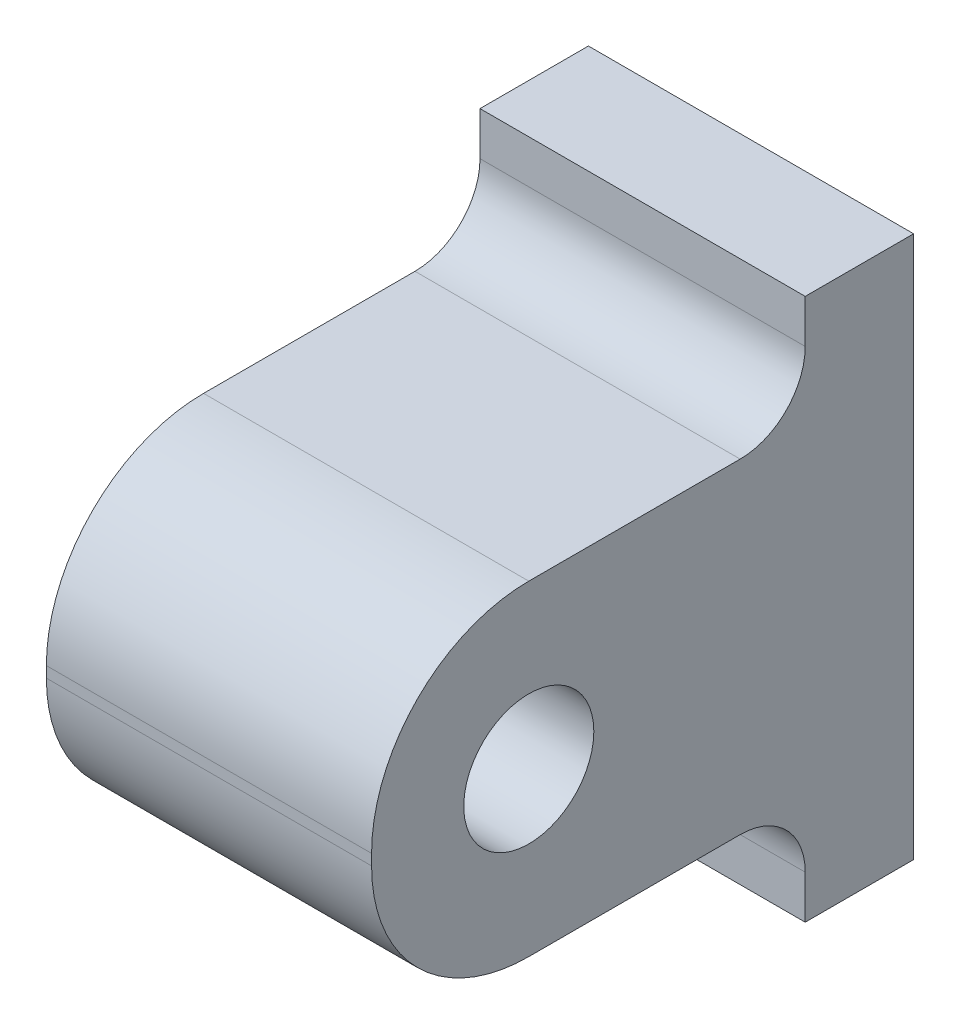
ISO-10303-21;
HEADER;
FILE_DESCRIPTION(('STEP AP214'),'2;1');
FILE_NAME('part.step','',(''),(''),'','','');
FILE_SCHEMA(('AUTOMOTIVE_DESIGN { 1 0 10303 214 1 1 1 1 }'));
ENDSEC;
DATA;
#1=APPLICATION_CONTEXT('core data for automotive mechanical design processes');
#2=APPLICATION_PROTOCOL_DEFINITION('international standard','automotive_design',2000,#1);
#3=PRODUCT_CONTEXT('',#1,'mechanical');
#4=PRODUCT('Part','Part','',(#3));
#5=PRODUCT_RELATED_PRODUCT_CATEGORY('part','',(#4));
#6=PRODUCT_DEFINITION_FORMATION('','',#4);
#7=PRODUCT_DEFINITION_CONTEXT('part definition',#1,'design');
#8=PRODUCT_DEFINITION('design','',#6,#7);
#9=PRODUCT_DEFINITION_SHAPE('','',#8);
#10=(LENGTH_UNIT() NAMED_UNIT(*) SI_UNIT(.MILLI.,.METRE.));
#11=(NAMED_UNIT(*) PLANE_ANGLE_UNIT() SI_UNIT($,.RADIAN.));
#12=(NAMED_UNIT(*) SI_UNIT($,.STERADIAN.) SOLID_ANGLE_UNIT());
#13=UNCERTAINTY_MEASURE_WITH_UNIT(LENGTH_MEASURE(1.E-05),#10,'distance_accuracy_value','');
#14=(GEOMETRIC_REPRESENTATION_CONTEXT(3) GLOBAL_UNCERTAINTY_ASSIGNED_CONTEXT((#13)) GLOBAL_UNIT_ASSIGNED_CONTEXT((#10,
#11,#12)) REPRESENTATION_CONTEXT('',''));
#15=CARTESIAN_POINT('',(0.,0.,0.));
#16=DIRECTION('',(0.,0.,1.));
#17=DIRECTION('',(1.,0.,0.));
#18=AXIS2_PLACEMENT_3D('',#15,#16,#17);
#19=CARTESIAN_POINT('',(30.,22.4138989571354,-29.0811612346303));
#20=DIRECTION('',(0.,-1.,0.));
#21=DIRECTION('',(0.,0.,-1.));
#22=AXIS2_PLACEMENT_3D('',#19,#20,#21);
#23=PLANE('',#22);
#24=DIRECTION('',(0.,0.,1.));
#25=VECTOR('',#24,1.);
#26=CARTESIAN_POINT('',(0.,22.4138989571354,-29.0811612346303));
#27=LINE('',#26,#25);
#28=CARTESIAN_POINT('',(0.,22.4138989571354,-29.0811612346303));
#29=VERTEX_POINT('',#28);
#30=CARTESIAN_POINT('',(0.,22.4138989571354,-19.0811612346303));
#31=VERTEX_POINT('',#30);
#32=EDGE_CURVE('E163',#29,#31,#27,.T.);
#33=ORIENTED_EDGE('',*,*,#32,.T.);
#34=DIRECTION('',(-1.,0.,0.));
#35=VECTOR('',#34,1.);
#36=CARTESIAN_POINT('',(30.,22.4138989571354,-19.0811612346303));
#37=LINE('',#36,#35);
#38=CARTESIAN_POINT('',(30.,22.4138989571354,-19.0811612346303));
#39=VERTEX_POINT('',#38);
#40=EDGE_CURVE('E11',#39,#31,#37,.T.);
#41=ORIENTED_EDGE('',*,*,#40,.F.);
#42=DIRECTION('',(0.,0.,1.));
#43=VECTOR('',#42,1.);
#44=CARTESIAN_POINT('',(30.,22.4138989571354,-29.0811612346303));
#45=LINE('',#44,#43);
#46=CARTESIAN_POINT('',(30.,22.4138989571354,-29.0811612346303));
#47=VERTEX_POINT('',#46);
#48=EDGE_CURVE('E186',#47,#39,#45,.T.);
#49=ORIENTED_EDGE('',*,*,#48,.F.);
#50=DIRECTION('',(-1.,0.,0.));
#51=VECTOR('',#50,1.);
#52=CARTESIAN_POINT('',(30.,22.4138989571354,-29.0811612346303));
#53=LINE('',#52,#51);
#54=EDGE_CURVE('E159',#47,#29,#53,.T.);
#55=ORIENTED_EDGE('',*,*,#54,.T.);
#56=EDGE_LOOP('',(#33,#41,#49,#55));
#57=FACE_BOUND('',#56,.T.);
#58=ADVANCED_FACE('F43',(#57),#23,.F.);
#59=CARTESIAN_POINT('',(30.,22.4138989571354,-19.0811612346303));
#60=DIRECTION('',(0.,0.,-1.));
#61=DIRECTION('',(-1.,0.,0.));
#62=AXIS2_PLACEMENT_3D('',#59,#60,#61);
#63=PLANE('',#62);
#64=DIRECTION('',(0.,-1.,0.));
#65=VECTOR('',#64,1.);
#66=CARTESIAN_POINT('',(0.,22.4138989571354,-19.0811612346303));
#67=LINE('',#66,#65);
#68=CARTESIAN_POINT('',(0.,18.4138989571354,-19.0811612346303));
#69=VERTEX_POINT('',#68);
#70=EDGE_CURVE('E166',#31,#69,#67,.T.);
#71=ORIENTED_EDGE('',*,*,#70,.T.);
#72=DIRECTION('',(-1.,0.,0.));
#73=VECTOR('',#72,1.);
#74=CARTESIAN_POINT('',(30.,18.4138989571354,-19.0811612346303));
#75=LINE('',#74,#73);
#76=CARTESIAN_POINT('',(30.,18.4138989571354,-19.0811612346303));
#77=VERTEX_POINT('',#76);
#78=EDGE_CURVE('E51',#77,#69,#75,.T.);
#79=ORIENTED_EDGE('',*,*,#78,.F.);
#80=DIRECTION('',(0.,-1.,0.));
#81=VECTOR('',#80,1.);
#82=CARTESIAN_POINT('',(30.,22.4138989571354,-19.0811612346303));
#83=LINE('',#82,#81);
#84=EDGE_CURVE('E114',#39,#77,#83,.T.);
#85=ORIENTED_EDGE('',*,*,#84,.F.);
#86=ORIENTED_EDGE('',*,*,#40,.T.);
#87=EDGE_LOOP('',(#71,#79,#85,#86));
#88=FACE_BOUND('',#87,.T.);
#89=ADVANCED_FACE('F265',(#88),#63,.F.);
#90=CARTESIAN_POINT('',(30.,18.4138989571354,-13.0811612346303));
#91=DIRECTION('',(-1.,0.,0.));
#92=DIRECTION('',(0.,0.,1.));
#93=AXIS2_PLACEMENT_3D('',#90,#91,#92);
#94=CYLINDRICAL_SURFACE('',#93,6.);
#95=CARTESIAN_POINT('',(0.,18.4138989571354,-13.0811612346303));
#96=DIRECTION('',(-1.,0.,0.));
#97=DIRECTION('',(0.,0.,-1.));
#98=AXIS2_PLACEMENT_3D('',#95,#96,#97);
#99=CIRCLE('',#98,6.);
#100=CARTESIAN_POINT('',(0.,12.4138989571354,-13.0811612346302));
#101=VERTEX_POINT('',#100);
#102=EDGE_CURVE('E169',#69,#101,#99,.T.);
#103=ORIENTED_EDGE('',*,*,#102,.T.);
#104=DIRECTION('',(-1.,0.,0.));
#105=VECTOR('',#104,1.);
#106=CARTESIAN_POINT('',(30.,12.4138989571354,-13.0811612346302));
#107=LINE('',#106,#105);
#108=CARTESIAN_POINT('',(30.,12.4138989571354,-13.0811612346302));
#109=VERTEX_POINT('',#108);
#110=EDGE_CURVE('E205',#109,#101,#107,.T.);
#111=ORIENTED_EDGE('',*,*,#110,.F.);
#112=CARTESIAN_POINT('',(30.,18.4138989571354,-13.0811612346303));
#113=DIRECTION('',(-1.,0.,0.));
#114=DIRECTION('',(0.,0.,-1.));
#115=AXIS2_PLACEMENT_3D('',#112,#113,#114);
#116=CIRCLE('',#115,6.);
#117=EDGE_CURVE('E213',#77,#109,#116,.T.);
#118=ORIENTED_EDGE('',*,*,#117,.F.);
#119=ORIENTED_EDGE('',*,*,#78,.T.);
#120=EDGE_LOOP('',(#103,#111,#118,#119));
#121=FACE_BOUND('',#120,.T.);
#122=ADVANCED_FACE('F211',(#121),#94,.F.);
#123=CARTESIAN_POINT('',(30.,12.4138989571354,-13.0811612346302));
#124=DIRECTION('',(0.,-1.,0.));
#125=DIRECTION('',(0.,0.,-1.));
#126=AXIS2_PLACEMENT_3D('',#123,#124,#125);
#127=PLANE('',#126);
#128=DIRECTION('',(0.,0.,1.));
#129=VECTOR('',#128,1.);
#130=CARTESIAN_POINT('',(0.,12.4138989571354,-13.0811612346302));
#131=LINE('',#130,#129);
#132=CARTESIAN_POINT('',(0.,12.4138989571354,6.41883876536963));
#133=VERTEX_POINT('',#132);
#134=EDGE_CURVE('E171',#101,#133,#131,.T.);
#135=ORIENTED_EDGE('',*,*,#134,.T.);
#136=DIRECTION('',(-1.,0.,0.));
#137=VECTOR('',#136,1.);
#138=CARTESIAN_POINT('',(30.,12.4138989571354,6.41883876536963));
#139=LINE('',#138,#137);
#140=CARTESIAN_POINT('',(30.,12.4138989571354,6.41883876536963));
#141=VERTEX_POINT('',#140);
#142=EDGE_CURVE('E202',#141,#133,#139,.T.);
#143=ORIENTED_EDGE('',*,*,#142,.F.);
#144=DIRECTION('',(0.,0.,1.));
#145=VECTOR('',#144,1.);
#146=CARTESIAN_POINT('',(30.,12.4138989571354,-13.0811612346302));
#147=LINE('',#146,#145);
#148=EDGE_CURVE('E231',#109,#141,#147,.T.);
#149=ORIENTED_EDGE('',*,*,#148,.F.);
#150=ORIENTED_EDGE('',*,*,#110,.T.);
#151=EDGE_LOOP('',(#135,#143,#149,#150));
#152=FACE_BOUND('',#151,.T.);
#153=ADVANCED_FACE('F222',(#152),#127,.F.);
#154=CARTESIAN_POINT('',(30.,-2.08610104286455,6.41883876536974));
#155=DIRECTION('',(-1.,0.,0.));
#156=DIRECTION('',(0.,0.,1.));
#157=AXIS2_PLACEMENT_3D('',#154,#155,#156);
#158=CYLINDRICAL_SURFACE('',#157,14.5);
#159=CARTESIAN_POINT('',(0.,-2.08610104286455,6.41883876536974));
#160=DIRECTION('',(1.,0.,0.));
#161=DIRECTION('',(0.,0.,-1.));
#162=AXIS2_PLACEMENT_3D('',#159,#160,#161);
#163=CIRCLE('',#162,14.5);
#164=CARTESIAN_POINT('',(0.,-2.08610104286465,20.9188387653697));
#165=VERTEX_POINT('',#164);
#166=EDGE_CURVE('E173',#133,#165,#163,.T.);
#167=ORIENTED_EDGE('',*,*,#166,.T.);
#168=DIRECTION('',(-1.,0.,0.));
#169=VECTOR('',#168,1.);
#170=CARTESIAN_POINT('',(30.,-2.08610104286465,20.9188387653697));
#171=LINE('',#170,#169);
#172=CARTESIAN_POINT('',(30.,-2.08610104286465,20.9188387653697));
#173=VERTEX_POINT('',#172);
#174=EDGE_CURVE('E199',#173,#165,#171,.T.);
#175=ORIENTED_EDGE('',*,*,#174,.F.);
#176=CARTESIAN_POINT('',(30.,-2.08610104286455,6.41883876536974));
#177=DIRECTION('',(1.,0.,0.));
#178=DIRECTION('',(0.,0.,-1.));
#179=AXIS2_PLACEMENT_3D('',#176,#177,#178);
#180=CIRCLE('',#179,14.5);
#181=EDGE_CURVE('E228',#141,#173,#180,.T.);
#182=ORIENTED_EDGE('',*,*,#181,.F.);
#183=ORIENTED_EDGE('',*,*,#142,.T.);
#184=EDGE_LOOP('',(#167,#175,#182,#183));
#185=FACE_BOUND('',#184,.T.);
#186=ADVANCED_FACE('F226',(#185),#158,.T.);
#187=CARTESIAN_POINT('',(30.,-2.08610104286465,20.9188387653697));
#188=DIRECTION('',(0.,0.,-1.));
#189=DIRECTION('',(-1.,0.,0.));
#190=AXIS2_PLACEMENT_3D('',#187,#188,#189);
#191=PLANE('',#190);
#192=DIRECTION('',(0.,-1.,0.));
#193=VECTOR('',#192,1.);
#194=CARTESIAN_POINT('',(0.,-2.08610104286465,20.9188387653697));
#195=LINE('',#194,#193);
#196=CARTESIAN_POINT('',(0.,-3.08610104286456,20.9188387653697));
#197=VERTEX_POINT('',#196);
#198=EDGE_CURVE('E175',#165,#197,#195,.T.);
#199=ORIENTED_EDGE('',*,*,#198,.T.);
#200=DIRECTION('',(-1.,0.,0.));
#201=VECTOR('',#200,1.);
#202=CARTESIAN_POINT('',(30.,-3.08610104286456,20.9188387653697));
#203=LINE('',#202,#201);
#204=CARTESIAN_POINT('',(30.,-3.08610104286456,20.9188387653697));
#205=VERTEX_POINT('',#204);
#206=EDGE_CURVE('E196',#205,#197,#203,.T.);
#207=ORIENTED_EDGE('',*,*,#206,.F.);
#208=DIRECTION('',(0.,-1.,0.));
#209=VECTOR('',#208,1.);
#210=CARTESIAN_POINT('',(30.,-2.08610104286465,20.9188387653697));
#211=LINE('',#210,#209);
#212=EDGE_CURVE('E230',#173,#205,#211,.T.);
#213=ORIENTED_EDGE('',*,*,#212,.F.);
#214=ORIENTED_EDGE('',*,*,#174,.T.);
#215=EDGE_LOOP('',(#199,#207,#213,#214));
#216=FACE_BOUND('',#215,.T.);
#217=ADVANCED_FACE('F278',(#216),#191,.F.);
#218=CARTESIAN_POINT('',(30.,-3.08610104286456,6.41883876536974));
#219=DIRECTION('',(-1.,0.,0.));
#220=DIRECTION('',(0.,0.,1.));
#221=AXIS2_PLACEMENT_3D('',#218,#219,#220);
#222=CYLINDRICAL_SURFACE('',#221,14.5);
#223=CARTESIAN_POINT('',(0.,-3.08610104286456,6.41883876536974));
#224=DIRECTION('',(1.,0.,0.));
#225=DIRECTION('',(0.,0.,1.));
#226=AXIS2_PLACEMENT_3D('',#223,#224,#225);
#227=CIRCLE('',#226,14.5);
#228=CARTESIAN_POINT('',(0.,-17.5861010428646,6.41883876536963));
#229=VERTEX_POINT('',#228);
#230=EDGE_CURVE('E177',#197,#229,#227,.T.);
#231=ORIENTED_EDGE('',*,*,#230,.T.);
#232=DIRECTION('',(-1.,0.,0.));
#233=VECTOR('',#232,1.);
#234=CARTESIAN_POINT('',(30.,-17.5861010428646,6.41883876536963));
#235=LINE('',#234,#233);
#236=CARTESIAN_POINT('',(30.,-17.5861010428646,6.41883876536963));
#237=VERTEX_POINT('',#236);
#238=EDGE_CURVE('E193',#237,#229,#235,.T.);
#239=ORIENTED_EDGE('',*,*,#238,.F.);
#240=CARTESIAN_POINT('',(30.,-3.08610104286456,6.41883876536974));
#241=DIRECTION('',(1.,0.,0.));
#242=DIRECTION('',(0.,0.,1.));
#243=AXIS2_PLACEMENT_3D('',#240,#241,#242);
#244=CIRCLE('',#243,14.5);
#245=EDGE_CURVE('E233',#205,#237,#244,.T.);
#246=ORIENTED_EDGE('',*,*,#245,.F.);
#247=ORIENTED_EDGE('',*,*,#206,.T.);
#248=EDGE_LOOP('',(#231,#239,#246,#247));
#249=FACE_BOUND('',#248,.T.);
#250=ADVANCED_FACE('F281',(#249),#222,.T.);
#251=CARTESIAN_POINT('',(30.,-17.5861010428646,-13.0811612346302));
#252=DIRECTION('',(0.,1.,0.));
#253=DIRECTION('',(0.,0.,1.));
#254=AXIS2_PLACEMENT_3D('',#251,#252,#253);
#255=PLANE('',#254);
#256=DIRECTION('',(0.,0.,-1.));
#257=VECTOR('',#256,1.);
#258=CARTESIAN_POINT('',(0.,-17.5861010428646,-13.0811612346302));
#259=LINE('',#258,#257);
#260=CARTESIAN_POINT('',(0.,-17.5861010428646,-13.0811612346302));
#261=VERTEX_POINT('',#260);
#262=EDGE_CURVE('E179',#229,#261,#259,.T.);
#263=ORIENTED_EDGE('',*,*,#262,.T.);
#264=DIRECTION('',(-1.,0.,0.));
#265=VECTOR('',#264,1.);
#266=CARTESIAN_POINT('',(30.,-17.5861010428646,-13.0811612346302));
#267=LINE('',#266,#265);
#268=CARTESIAN_POINT('',(30.,-17.5861010428646,-13.0811612346302));
#269=VERTEX_POINT('',#268);
#270=EDGE_CURVE('E190',#269,#261,#267,.T.);
#271=ORIENTED_EDGE('',*,*,#270,.F.);
#272=DIRECTION('',(0.,0.,-1.));
#273=VECTOR('',#272,1.);
#274=CARTESIAN_POINT('',(30.,-17.5861010428646,-13.0811612346302));
#275=LINE('',#274,#273);
#276=EDGE_CURVE('E239',#237,#269,#275,.T.);
#277=ORIENTED_EDGE('',*,*,#276,.F.);
#278=ORIENTED_EDGE('',*,*,#238,.T.);
#279=EDGE_LOOP('',(#263,#271,#277,#278));
#280=FACE_BOUND('',#279,.T.);
#281=ADVANCED_FACE('F245',(#280),#255,.F.);
#282=CARTESIAN_POINT('',(30.,-23.5861010428646,-13.0811612346303));
#283=DIRECTION('',(-1.,0.,0.));
#284=DIRECTION('',(0.,0.,1.));
#285=AXIS2_PLACEMENT_3D('',#282,#283,#284);
#286=CYLINDRICAL_SURFACE('',#285,6.);
#287=CARTESIAN_POINT('',(0.,-23.5861010428646,-13.0811612346303));
#288=DIRECTION('',(-1.,0.,0.));
#289=DIRECTION('',(0.,0.,-1.));
#290=AXIS2_PLACEMENT_3D('',#287,#288,#289);
#291=CIRCLE('',#290,6.);
#292=CARTESIAN_POINT('',(0.,-23.5861010428646,-19.0811612346303));
#293=VERTEX_POINT('',#292);
#294=EDGE_CURVE('E181',#261,#293,#291,.T.);
#295=ORIENTED_EDGE('',*,*,#294,.T.);
#296=DIRECTION('',(-1.,0.,0.));
#297=VECTOR('',#296,1.);
#298=CARTESIAN_POINT('',(30.,-23.5861010428646,-19.0811612346303));
#299=LINE('',#298,#297);
#300=CARTESIAN_POINT('',(30.,-23.5861010428646,-19.0811612346303));
#301=VERTEX_POINT('',#300);
#302=EDGE_CURVE('E154',#301,#293,#299,.T.);
#303=ORIENTED_EDGE('',*,*,#302,.F.);
#304=CARTESIAN_POINT('',(30.,-23.5861010428646,-13.0811612346303));
#305=DIRECTION('',(-1.,0.,0.));
#306=DIRECTION('',(0.,0.,-1.));
#307=AXIS2_PLACEMENT_3D('',#304,#305,#306);
#308=CIRCLE('',#307,6.);
#309=EDGE_CURVE('E145',#269,#301,#308,.T.);
#310=ORIENTED_EDGE('',*,*,#309,.F.);
#311=ORIENTED_EDGE('',*,*,#270,.T.);
#312=EDGE_LOOP('',(#295,#303,#310,#311));
#313=FACE_BOUND('',#312,.T.);
#314=ADVANCED_FACE('F249',(#313),#286,.F.);
#315=CARTESIAN_POINT('',(30.,-27.5861010428646,-19.0811612346303));
#316=DIRECTION('',(0.,0.,-1.));
#317=DIRECTION('',(-1.,0.,0.));
#318=AXIS2_PLACEMENT_3D('',#315,#316,#317);
#319=PLANE('',#318);
#320=DIRECTION('',(0.,-1.,0.));
#321=VECTOR('',#320,1.);
#322=CARTESIAN_POINT('',(0.,-27.5861010428646,-19.0811612346303));
#323=LINE('',#322,#321);
#324=CARTESIAN_POINT('',(0.,-27.5861010428646,-19.0811612346303));
#325=VERTEX_POINT('',#324);
#326=EDGE_CURVE('E153',#293,#325,#323,.T.);
#327=ORIENTED_EDGE('',*,*,#326,.T.);
#328=DIRECTION('',(-1.,0.,0.));
#329=VECTOR('',#328,1.);
#330=CARTESIAN_POINT('',(30.,-27.5861010428646,-19.0811612346303));
#331=LINE('',#330,#329);
#332=CARTESIAN_POINT('',(30.,-27.5861010428646,-19.0811612346303));
#333=VERTEX_POINT('',#332);
#334=EDGE_CURVE('E150',#333,#325,#331,.T.);
#335=ORIENTED_EDGE('',*,*,#334,.F.);
#336=DIRECTION('',(0.,-1.,0.));
#337=VECTOR('',#336,1.);
#338=CARTESIAN_POINT('',(30.,-27.5861010428646,-19.0811612346303));
#339=LINE('',#338,#337);
#340=EDGE_CURVE('E139',#301,#333,#339,.T.);
#341=ORIENTED_EDGE('',*,*,#340,.F.);
#342=ORIENTED_EDGE('',*,*,#302,.T.);
#343=EDGE_LOOP('',(#327,#335,#341,#342));
#344=FACE_BOUND('',#343,.T.);
#345=ADVANCED_FACE('F151',(#344),#319,.F.);
#346=CARTESIAN_POINT('',(30.,-27.5861010428646,-29.0811612346303));
#347=DIRECTION('',(0.,1.,0.));
#348=DIRECTION('',(0.,0.,1.));
#349=AXIS2_PLACEMENT_3D('',#346,#347,#348);
#350=PLANE('',#349);
#351=DIRECTION('',(0.,0.,-1.));
#352=VECTOR('',#351,1.);
#353=CARTESIAN_POINT('',(0.,-27.5861010428646,-29.0811612346303));
#354=LINE('',#353,#352);
#355=CARTESIAN_POINT('',(0.,-27.5861010428646,-29.0811612346303));
#356=VERTEX_POINT('',#355);
#357=EDGE_CURVE('E100',#325,#356,#354,.T.);
#358=ORIENTED_EDGE('',*,*,#357,.T.);
#359=DIRECTION('',(-1.,0.,0.));
#360=VECTOR('',#359,1.);
#361=CARTESIAN_POINT('',(30.,-27.5861010428646,-29.0811612346303));
#362=LINE('',#361,#360);
#363=CARTESIAN_POINT('',(30.,-27.5861010428646,-29.0811612346303));
#364=VERTEX_POINT('',#363);
#365=EDGE_CURVE('E155',#364,#356,#362,.T.);
#366=ORIENTED_EDGE('',*,*,#365,.F.);
#367=DIRECTION('',(0.,0.,-1.));
#368=VECTOR('',#367,1.);
#369=CARTESIAN_POINT('',(30.,-27.5861010428646,-29.0811612346303));
#370=LINE('',#369,#368);
#371=EDGE_CURVE('E143',#333,#364,#370,.T.);
#372=ORIENTED_EDGE('',*,*,#371,.F.);
#373=ORIENTED_EDGE('',*,*,#334,.T.);
#374=EDGE_LOOP('',(#358,#366,#372,#373));
#375=FACE_BOUND('',#374,.T.);
#376=ADVANCED_FACE('F157',(#375),#350,.F.);
#377=CARTESIAN_POINT('',(30.,22.4138989571354,-29.0811612346303));
#378=DIRECTION('',(0.,0.,1.));
#379=DIRECTION('',(1.,0.,0.));
#380=AXIS2_PLACEMENT_3D('',#377,#378,#379);
#381=PLANE('',#380);
#382=DIRECTION('',(0.,1.,0.));
#383=VECTOR('',#382,1.);
#384=CARTESIAN_POINT('',(0.,22.4138989571354,-29.0811612346303));
#385=LINE('',#384,#383);
#386=EDGE_CURVE('E106',#356,#29,#385,.T.);
#387=ORIENTED_EDGE('',*,*,#386,.T.);
#388=ORIENTED_EDGE('',*,*,#54,.F.);
#389=DIRECTION('',(0.,1.,0.));
#390=VECTOR('',#389,1.);
#391=CARTESIAN_POINT('',(30.,22.4138989571354,-29.0811612346303));
#392=LINE('',#391,#390);
#393=EDGE_CURVE('E59',#364,#47,#392,.T.);
#394=ORIENTED_EDGE('',*,*,#393,.F.);
#395=ORIENTED_EDGE('',*,*,#365,.T.);
#396=EDGE_LOOP('',(#387,#388,#394,#395));
#397=FACE_BOUND('',#396,.T.);
#398=ADVANCED_FACE('F253',(#397),#381,.F.);
#399=CARTESIAN_POINT('',(30.,18.4138989571354,-13.0811612346303));
#400=DIRECTION('',(1.,0.,0.));
#401=DIRECTION('',(0.,0.,-1.));
#402=AXIS2_PLACEMENT_3D('',#399,#400,#401);
#403=PLANE('',#402);
#404=CARTESIAN_POINT('',(30.,-2.58610104286461,6.41883876536973));
#405=DIRECTION('',(1.,0.,0.));
#406=DIRECTION('',(0.,0.,-1.));
#407=AXIS2_PLACEMENT_3D('',#404,#405,#406);
#408=CIRCLE('',#407,6.);
#409=CARTESIAN_POINT('',(30.,-2.58610104286461,0.418838765369733));
#410=VERTEX_POINT('',#409);
#411=EDGE_CURVE('E167',#410,#410,#408,.T.);
#412=ORIENTED_EDGE('',*,*,#411,.F.);
#413=EDGE_LOOP('',(#412));
#414=FACE_BOUND('',#413,.T.);
#415=ORIENTED_EDGE('',*,*,#48,.T.);
#416=ORIENTED_EDGE('',*,*,#84,.T.);
#417=ORIENTED_EDGE('',*,*,#117,.T.);
#418=ORIENTED_EDGE('',*,*,#148,.T.);
#419=ORIENTED_EDGE('',*,*,#181,.T.);
#420=ORIENTED_EDGE('',*,*,#212,.T.);
#421=ORIENTED_EDGE('',*,*,#245,.T.);
#422=ORIENTED_EDGE('',*,*,#276,.T.);
#423=ORIENTED_EDGE('',*,*,#309,.T.);
#424=ORIENTED_EDGE('',*,*,#340,.T.);
#425=ORIENTED_EDGE('',*,*,#371,.T.);
#426=ORIENTED_EDGE('',*,*,#393,.T.);
#427=EDGE_LOOP('',(#415,#416,#417,#418,#419,#420,#421,#422,#423,#424,#425,#426));
#428=FACE_BOUND('',#427,.T.);
#429=ADVANCED_FACE('F141',(#414,#428),#403,.T.);
#430=CARTESIAN_POINT('',(0.,18.4138989571354,-13.0811612346303));
#431=DIRECTION('',(1.,0.,0.));
#432=DIRECTION('',(0.,0.,-1.));
#433=AXIS2_PLACEMENT_3D('',#430,#431,#432);
#434=PLANE('',#433);
#435=CARTESIAN_POINT('',(0.,-2.58610104286461,6.41883876536973));
#436=DIRECTION('',(1.,0.,0.));
#437=DIRECTION('',(0.,0.,-1.));
#438=AXIS2_PLACEMENT_3D('',#435,#436,#437);
#439=CIRCLE('',#438,6.);
#440=CARTESIAN_POINT('',(0.,-2.58610104286461,0.418838765369733));
#441=VERTEX_POINT('',#440);
#442=EDGE_CURVE('E337',#441,#441,#439,.T.);
#443=ORIENTED_EDGE('',*,*,#442,.T.);
#444=EDGE_LOOP('',(#443));
#445=FACE_BOUND('',#444,.T.);
#446=ORIENTED_EDGE('',*,*,#32,.F.);
#447=ORIENTED_EDGE('',*,*,#386,.F.);
#448=ORIENTED_EDGE('',*,*,#357,.F.);
#449=ORIENTED_EDGE('',*,*,#326,.F.);
#450=ORIENTED_EDGE('',*,*,#294,.F.);
#451=ORIENTED_EDGE('',*,*,#262,.F.);
#452=ORIENTED_EDGE('',*,*,#230,.F.);
#453=ORIENTED_EDGE('',*,*,#198,.F.);
#454=ORIENTED_EDGE('',*,*,#166,.F.);
#455=ORIENTED_EDGE('',*,*,#134,.F.);
#456=ORIENTED_EDGE('',*,*,#102,.F.);
#457=ORIENTED_EDGE('',*,*,#70,.F.);
#458=EDGE_LOOP('',(#446,#447,#448,#449,#450,#451,#452,#453,#454,#455,#456,#457));
#459=FACE_BOUND('',#458,.T.);
#460=ADVANCED_FACE('F217',(#445,#459),#434,.F.);
#461=CARTESIAN_POINT('',(30.,-2.58610104286461,6.41883876536973));
#462=DIRECTION('',(-1.,0.,0.));
#463=DIRECTION('',(0.,0.,1.));
#464=AXIS2_PLACEMENT_3D('',#461,#462,#463);
#465=CYLINDRICAL_SURFACE('',#464,6.);
#466=ORIENTED_EDGE('',*,*,#411,.T.);
#467=EDGE_LOOP('',(#466));
#468=FACE_BOUND('',#467,.T.);
#469=ORIENTED_EDGE('',*,*,#442,.F.);
#470=EDGE_LOOP('',(#469));
#471=FACE_BOUND('',#470,.T.);
#472=ADVANCED_FACE('F320',(#468,#471),#465,.F.);
#473=CLOSED_SHELL('',(#58,#89,#122,#153,#186,#217,#250,#281,#314,#345,#376,#398,#429,#460,#472));
#474=MANIFOLD_SOLID_BREP('B2',#473);
#475=ADVANCED_BREP_SHAPE_REPRESENTATION('',(#18,#474),#14);
#476=SHAPE_DEFINITION_REPRESENTATION(#9,#475);
ENDSEC;
END-ISO-10303-21;
